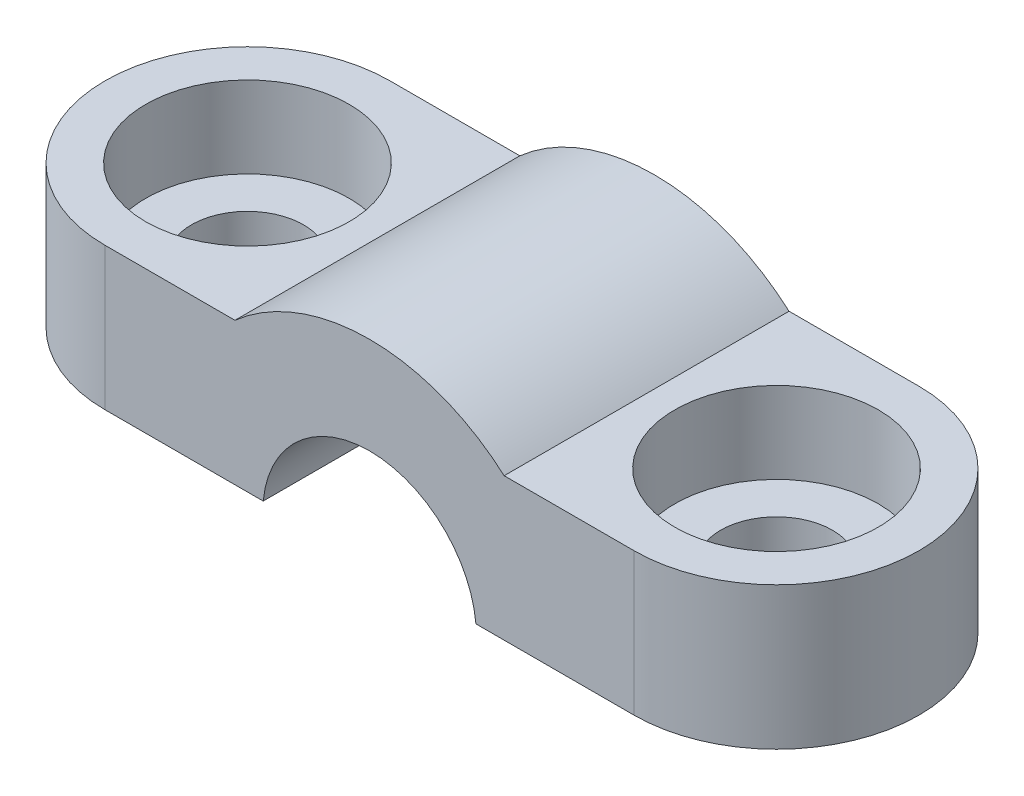
ISO-10303-21;
HEADER;
FILE_DESCRIPTION(('STEP AP214'),'2;1');
FILE_NAME('part.step','',(''),(''),'','','');
FILE_SCHEMA(('AUTOMOTIVE_DESIGN { 1 0 10303 214 1 1 1 1 }'));
ENDSEC;
DATA;
#1=APPLICATION_CONTEXT('core data for automotive mechanical design processes');
#2=APPLICATION_PROTOCOL_DEFINITION('international standard','automotive_design',2000,#1);
#3=PRODUCT_CONTEXT('',#1,'mechanical');
#4=PRODUCT('Part','Part','',(#3));
#5=PRODUCT_RELATED_PRODUCT_CATEGORY('part','',(#4));
#6=PRODUCT_DEFINITION_FORMATION('','',#4);
#7=PRODUCT_DEFINITION_CONTEXT('part definition',#1,'design');
#8=PRODUCT_DEFINITION('design','',#6,#7);
#9=PRODUCT_DEFINITION_SHAPE('','',#8);
#10=(LENGTH_UNIT() NAMED_UNIT(*) SI_UNIT(.MILLI.,.METRE.));
#11=(NAMED_UNIT(*) PLANE_ANGLE_UNIT() SI_UNIT($,.RADIAN.));
#12=(NAMED_UNIT(*) SI_UNIT($,.STERADIAN.) SOLID_ANGLE_UNIT());
#13=UNCERTAINTY_MEASURE_WITH_UNIT(LENGTH_MEASURE(1.E-05),#10,'distance_accuracy_value','');
#14=(GEOMETRIC_REPRESENTATION_CONTEXT(3) GLOBAL_UNCERTAINTY_ASSIGNED_CONTEXT((#13)) GLOBAL_UNIT_ASSIGNED_CONTEXT((#10,
#11,#12)) REPRESENTATION_CONTEXT('',''));
#15=CARTESIAN_POINT('',(0.,0.,0.));
#16=DIRECTION('',(0.,0.,1.));
#17=DIRECTION('',(1.,0.,0.));
#18=AXIS2_PLACEMENT_3D('',#15,#16,#17);
#19=CARTESIAN_POINT('',(-13.,7.,-7.00000000000001));
#20=DIRECTION('',(0.,1.,0.));
#21=DIRECTION('',(0.,0.,1.));
#22=AXIS2_PLACEMENT_3D('',#19,#20,#21);
#23=PLANE('',#22);
#24=DIRECTION('',(0.,0.,1.));
#25=VECTOR('',#24,1.);
#26=CARTESIAN_POINT('',(-6.61437827766148,7.,-27.4629120178363));
#27=LINE('',#26,#25);
#28=CARTESIAN_POINT('',(-6.61437827766148,7.,-14.));
#29=VERTEX_POINT('',#28);
#30=CARTESIAN_POINT('',(-6.61437827766148,7.,0.));
#31=VERTEX_POINT('',#30);
#32=EDGE_CURVE('E110',#29,#31,#27,.T.);
#33=ORIENTED_EDGE('',*,*,#32,.F.);
#34=DIRECTION('',(-1.,0.,0.));
#35=VECTOR('',#34,1.);
#36=CARTESIAN_POINT('',(-13.,7.,-14.));
#37=LINE('',#36,#35);
#38=CARTESIAN_POINT('',(-13.,7.,-14.));
#39=VERTEX_POINT('',#38);
#40=EDGE_CURVE('E96',#29,#39,#37,.T.);
#41=ORIENTED_EDGE('',*,*,#40,.T.);
#42=CARTESIAN_POINT('',(-13.,7.,-7.00000000000001));
#43=DIRECTION('',(0.,1.,0.));
#44=DIRECTION('',(0.,0.,1.));
#45=AXIS2_PLACEMENT_3D('',#42,#43,#44);
#46=CIRCLE('',#45,7.);
#47=CARTESIAN_POINT('',(-13.,7.,0.));
#48=VERTEX_POINT('',#47);
#49=EDGE_CURVE('E149',#39,#48,#46,.T.);
#50=ORIENTED_EDGE('',*,*,#49,.T.);
#51=DIRECTION('',(1.,0.,0.));
#52=VECTOR('',#51,1.);
#53=CARTESIAN_POINT('',(-13.,7.,0.));
#54=LINE('',#53,#52);
#55=EDGE_CURVE('E112',#48,#31,#54,.T.);
#56=ORIENTED_EDGE('',*,*,#55,.T.);
#57=EDGE_LOOP('',(#33,#41,#50,#56));
#58=FACE_BOUND('',#57,.T.);
#59=CARTESIAN_POINT('',(-13.,7.,-7.00000000000001));
#60=DIRECTION('',(0.,1.,0.));
#61=DIRECTION('',(0.,0.,1.));
#62=AXIS2_PLACEMENT_3D('',#59,#60,#61);
#63=CIRCLE('',#62,5.);
#64=CARTESIAN_POINT('',(-13.,7.,-2.00000000000001));
#65=VERTEX_POINT('',#64);
#66=EDGE_CURVE('E139',#65,#65,#63,.T.);
#67=ORIENTED_EDGE('',*,*,#66,.F.);
#68=EDGE_LOOP('',(#67));
#69=FACE_BOUND('',#68,.T.);
#70=ADVANCED_FACE('F33',(#58,#69),#23,.T.);
#71=CARTESIAN_POINT('',(-13.,0.,-7.00000000000001));
#72=DIRECTION('',(0.,1.,0.));
#73=DIRECTION('',(0.,0.,1.));
#74=AXIS2_PLACEMENT_3D('',#71,#72,#73);
#75=PLANE('',#74);
#76=CARTESIAN_POINT('',(-13.,0.,-7.00000000000001));
#77=DIRECTION('',(0.,1.,0.));
#78=DIRECTION('',(0.,0.,1.));
#79=AXIS2_PLACEMENT_3D('',#76,#77,#78);
#80=CIRCLE('',#79,2.75);
#81=CARTESIAN_POINT('',(-13.,0.,-4.25000000000001));
#82=VERTEX_POINT('',#81);
#83=EDGE_CURVE('E145',#82,#82,#80,.T.);
#84=ORIENTED_EDGE('',*,*,#83,.T.);
#85=EDGE_LOOP('',(#84));
#86=FACE_BOUND('',#85,.T.);
#87=DIRECTION('',(-1.,0.,0.));
#88=VECTOR('',#87,1.);
#89=CARTESIAN_POINT('',(-13.,0.,-14.));
#90=LINE('',#89,#88);
#91=CARTESIAN_POINT('',(-5.22613624009172,0.,-14.));
#92=VERTEX_POINT('',#91);
#93=CARTESIAN_POINT('',(-13.,0.,-14.));
#94=VERTEX_POINT('',#93);
#95=EDGE_CURVE('E163',#92,#94,#90,.T.);
#96=ORIENTED_EDGE('',*,*,#95,.F.);
#97=DIRECTION('',(0.,0.,1.));
#98=VECTOR('',#97,1.);
#99=CARTESIAN_POINT('',(-5.22613624009172,0.,-14.));
#100=LINE('',#99,#98);
#101=CARTESIAN_POINT('',(-5.22613624009172,0.,0.));
#102=VERTEX_POINT('',#101);
#103=EDGE_CURVE('E11',#92,#102,#100,.T.);
#104=ORIENTED_EDGE('',*,*,#103,.T.);
#105=DIRECTION('',(1.,0.,0.));
#106=VECTOR('',#105,1.);
#107=CARTESIAN_POINT('',(-13.,0.,0.));
#108=LINE('',#107,#106);
#109=CARTESIAN_POINT('',(-13.,0.,0.));
#110=VERTEX_POINT('',#109);
#111=EDGE_CURVE('E158',#110,#102,#108,.T.);
#112=ORIENTED_EDGE('',*,*,#111,.F.);
#113=CARTESIAN_POINT('',(-13.,0.,-7.00000000000001));
#114=DIRECTION('',(0.,1.,0.));
#115=DIRECTION('',(0.,0.,1.));
#116=AXIS2_PLACEMENT_3D('',#113,#114,#115);
#117=CIRCLE('',#116,7.);
#118=EDGE_CURVE('E148',#94,#110,#117,.T.);
#119=ORIENTED_EDGE('',*,*,#118,.F.);
#120=EDGE_LOOP('',(#96,#104,#112,#119));
#121=FACE_BOUND('',#120,.T.);
#122=ADVANCED_FACE('F196',(#86,#121),#75,.F.);
#123=CARTESIAN_POINT('',(-13.,0.,-7.00000000000001));
#124=DIRECTION('',(0.,1.,0.));
#125=DIRECTION('',(0.,0.,1.));
#126=AXIS2_PLACEMENT_3D('',#123,#124,#125);
#127=CYLINDRICAL_SURFACE('',#126,2.75);
#128=ORIENTED_EDGE('',*,*,#83,.F.);
#129=EDGE_LOOP('',(#128));
#130=FACE_BOUND('',#129,.T.);
#131=CARTESIAN_POINT('',(-13.,3.,-7.00000000000001));
#132=DIRECTION('',(0.,1.,0.));
#133=DIRECTION('',(0.,0.,1.));
#134=AXIS2_PLACEMENT_3D('',#131,#132,#133);
#135=CIRCLE('',#134,2.75);
#136=CARTESIAN_POINT('',(-13.,3.,-4.25000000000001));
#137=VERTEX_POINT('',#136);
#138=EDGE_CURVE('E138',#137,#137,#135,.F.);
#139=ORIENTED_EDGE('',*,*,#138,.F.);
#140=EDGE_LOOP('',(#139));
#141=FACE_BOUND('',#140,.T.);
#142=ADVANCED_FACE('F201',(#130,#141),#127,.F.);
#143=CARTESIAN_POINT('',(-13.,7.,-7.00000000000001));
#144=DIRECTION('',(0.,-1.,0.));
#145=DIRECTION('',(0.,0.,-1.));
#146=AXIS2_PLACEMENT_3D('',#143,#144,#145);
#147=CYLINDRICAL_SURFACE('',#146,7.);
#148=ORIENTED_EDGE('',*,*,#118,.T.);
#149=DIRECTION('',(0.,-1.,0.));
#150=VECTOR('',#149,1.);
#151=CARTESIAN_POINT('',(-13.,7.,0.));
#152=LINE('',#151,#150);
#153=EDGE_CURVE('E172',#48,#110,#152,.T.);
#154=ORIENTED_EDGE('',*,*,#153,.F.);
#155=ORIENTED_EDGE('',*,*,#49,.F.);
#156=DIRECTION('',(0.,-1.,0.));
#157=VECTOR('',#156,1.);
#158=CARTESIAN_POINT('',(-13.,7.,-14.));
#159=LINE('',#158,#157);
#160=EDGE_CURVE('E103',#39,#94,#159,.T.);
#161=ORIENTED_EDGE('',*,*,#160,.T.);
#162=EDGE_LOOP('',(#148,#154,#155,#161));
#163=FACE_BOUND('',#162,.T.);
#164=ADVANCED_FACE('F35',(#163),#147,.T.);
#165=CARTESIAN_POINT('',(-13.,7.,0.));
#166=DIRECTION('',(0.,0.,-1.));
#167=DIRECTION('',(-1.,0.,0.));
#168=AXIS2_PLACEMENT_3D('',#165,#166,#167);
#169=PLANE('',#168);
#170=ORIENTED_EDGE('',*,*,#111,.T.);
#171=CARTESIAN_POINT('',(0.,-0.5,0.));
#172=DIRECTION('',(0.,0.,1.));
#173=DIRECTION('',(1.,0.,0.));
#174=AXIS2_PLACEMENT_3D('',#171,#172,#173);
#175=CIRCLE('',#174,5.25);
#176=CARTESIAN_POINT('',(5.22613624009172,0.,0.));
#177=VERTEX_POINT('',#176);
#178=EDGE_CURVE('E119',#177,#102,#175,.T.);
#179=ORIENTED_EDGE('',*,*,#178,.F.);
#180=CARTESIAN_POINT('',(13.,0.,0.));
#181=VERTEX_POINT('',#180);
#182=EDGE_CURVE('E157',#177,#181,#108,.T.);
#183=ORIENTED_EDGE('',*,*,#182,.T.);
#184=DIRECTION('',(0.,-1.,0.));
#185=VECTOR('',#184,1.);
#186=CARTESIAN_POINT('',(13.,7.,0.));
#187=LINE('',#186,#185);
#188=CARTESIAN_POINT('',(13.,7.,0.));
#189=VERTEX_POINT('',#188);
#190=EDGE_CURVE('E169',#189,#181,#187,.T.);
#191=ORIENTED_EDGE('',*,*,#190,.F.);
#192=CARTESIAN_POINT('',(6.61437827766147,7.,0.));
#193=VERTEX_POINT('',#192);
#194=EDGE_CURVE('E151',#193,#189,#54,.T.);
#195=ORIENTED_EDGE('',*,*,#194,.F.);
#196=CARTESIAN_POINT('',(0.,-0.5,0.));
#197=DIRECTION('',(0.,0.,1.));
#198=DIRECTION('',(1.,0.,0.));
#199=AXIS2_PLACEMENT_3D('',#196,#197,#198);
#200=CIRCLE('',#199,10.);
#201=EDGE_CURVE('E116',#193,#31,#200,.T.);
#202=ORIENTED_EDGE('',*,*,#201,.T.);
#203=ORIENTED_EDGE('',*,*,#55,.F.);
#204=ORIENTED_EDGE('',*,*,#153,.T.);
#205=EDGE_LOOP('',(#170,#179,#183,#191,#195,#202,#203,#204));
#206=FACE_BOUND('',#205,.T.);
#207=ADVANCED_FACE('F193',(#206),#169,.F.);
#208=CARTESIAN_POINT('',(13.,7.,-7.00000000000001));
#209=DIRECTION('',(0.,-1.,0.));
#210=DIRECTION('',(0.,0.,-1.));
#211=AXIS2_PLACEMENT_3D('',#208,#209,#210);
#212=CYLINDRICAL_SURFACE('',#211,7.);
#213=CARTESIAN_POINT('',(13.,0.,-7.00000000000001));
#214=DIRECTION('',(0.,1.,0.));
#215=DIRECTION('',(0.,0.,-1.));
#216=AXIS2_PLACEMENT_3D('',#213,#214,#215);
#217=CIRCLE('',#216,7.);
#218=CARTESIAN_POINT('',(13.,0.,-14.));
#219=VERTEX_POINT('',#218);
#220=EDGE_CURVE('E161',#181,#219,#217,.T.);
#221=ORIENTED_EDGE('',*,*,#220,.T.);
#222=DIRECTION('',(0.,-1.,0.));
#223=VECTOR('',#222,1.);
#224=CARTESIAN_POINT('',(13.,7.,-14.));
#225=LINE('',#224,#223);
#226=CARTESIAN_POINT('',(13.,7.,-14.));
#227=VERTEX_POINT('',#226);
#228=EDGE_CURVE('E166',#227,#219,#225,.T.);
#229=ORIENTED_EDGE('',*,*,#228,.F.);
#230=CARTESIAN_POINT('',(13.,7.,-7.00000000000001));
#231=DIRECTION('',(0.,1.,0.));
#232=DIRECTION('',(0.,0.,-1.));
#233=AXIS2_PLACEMENT_3D('',#230,#231,#232);
#234=CIRCLE('',#233,7.);
#235=EDGE_CURVE('E107',#189,#227,#234,.T.);
#236=ORIENTED_EDGE('',*,*,#235,.F.);
#237=ORIENTED_EDGE('',*,*,#190,.T.);
#238=EDGE_LOOP('',(#221,#229,#236,#237));
#239=FACE_BOUND('',#238,.T.);
#240=ADVANCED_FACE('F190',(#239),#212,.T.);
#241=CARTESIAN_POINT('',(-13.,7.,-14.));
#242=DIRECTION('',(0.,0.,1.));
#243=DIRECTION('',(1.,0.,0.));
#244=AXIS2_PLACEMENT_3D('',#241,#242,#243);
#245=PLANE('',#244);
#246=CARTESIAN_POINT('',(5.22613624009171,0.,-14.));
#247=VERTEX_POINT('',#246);
#248=EDGE_CURVE('E152',#219,#247,#90,.T.);
#249=ORIENTED_EDGE('',*,*,#248,.T.);
#250=CARTESIAN_POINT('',(0.,-0.5,-14.));
#251=DIRECTION('',(0.,0.,1.));
#252=DIRECTION('',(1.,0.,0.));
#253=AXIS2_PLACEMENT_3D('',#250,#251,#252);
#254=CIRCLE('',#253,5.25);
#255=EDGE_CURVE('E121',#247,#92,#254,.T.);
#256=ORIENTED_EDGE('',*,*,#255,.T.);
#257=ORIENTED_EDGE('',*,*,#95,.T.);
#258=ORIENTED_EDGE('',*,*,#160,.F.);
#259=ORIENTED_EDGE('',*,*,#40,.F.);
#260=CARTESIAN_POINT('',(0.,-0.5,-14.));
#261=DIRECTION('',(0.,0.,1.));
#262=DIRECTION('',(1.,0.,0.));
#263=AXIS2_PLACEMENT_3D('',#260,#261,#262);
#264=CIRCLE('',#263,10.);
#265=CARTESIAN_POINT('',(6.61437827766147,7.,-14.));
#266=VERTEX_POINT('',#265);
#267=EDGE_CURVE('E101',#29,#266,#264,.F.);
#268=ORIENTED_EDGE('',*,*,#267,.T.);
#269=EDGE_CURVE('E48',#227,#266,#37,.T.);
#270=ORIENTED_EDGE('',*,*,#269,.F.);
#271=ORIENTED_EDGE('',*,*,#228,.T.);
#272=EDGE_LOOP('',(#249,#256,#257,#258,#259,#268,#270,#271));
#273=FACE_BOUND('',#272,.T.);
#274=ADVANCED_FACE('F99',(#273),#245,.F.);
#275=DIRECTION('',(0.,0.,1.));
#276=VECTOR('',#275,1.);
#277=CARTESIAN_POINT('',(6.61437827766148,7.,-27.4629120178363));
#278=LINE('',#277,#276);
#279=EDGE_CURVE('E53',#266,#193,#278,.T.);
#280=ORIENTED_EDGE('',*,*,#279,.T.);
#281=ORIENTED_EDGE('',*,*,#194,.T.);
#282=ORIENTED_EDGE('',*,*,#235,.T.);
#283=ORIENTED_EDGE('',*,*,#269,.T.);
#284=EDGE_LOOP('',(#280,#281,#282,#283));
#285=FACE_BOUND('',#284,.T.);
#286=CARTESIAN_POINT('',(13.,7.,-7.00000000000001));
#287=DIRECTION('',(0.,1.,0.));
#288=DIRECTION('',(0.,0.,-1.));
#289=AXIS2_PLACEMENT_3D('',#286,#287,#288);
#290=CIRCLE('',#289,5.);
#291=CARTESIAN_POINT('',(13.,7.,-12.));
#292=VERTEX_POINT('',#291);
#293=EDGE_CURVE('E127',#292,#292,#290,.T.);
#294=ORIENTED_EDGE('',*,*,#293,.F.);
#295=EDGE_LOOP('',(#294));
#296=FACE_BOUND('',#295,.T.);
#297=ADVANCED_FACE('F210',(#285,#296),#23,.T.);
#298=CARTESIAN_POINT('',(13.,0.,-7.00000000000001));
#299=DIRECTION('',(0.,1.,0.));
#300=DIRECTION('',(0.,0.,-1.));
#301=AXIS2_PLACEMENT_3D('',#298,#299,#300);
#302=CIRCLE('',#301,2.75);
#303=CARTESIAN_POINT('',(13.,0.,-9.75000000000001));
#304=VERTEX_POINT('',#303);
#305=EDGE_CURVE('E142',#304,#304,#302,.T.);
#306=ORIENTED_EDGE('',*,*,#305,.T.);
#307=EDGE_LOOP('',(#306));
#308=FACE_BOUND('',#307,.T.);
#309=ORIENTED_EDGE('',*,*,#182,.F.);
#310=DIRECTION('',(0.,0.,1.));
#311=VECTOR('',#310,1.);
#312=CARTESIAN_POINT('',(5.22613624009172,0.,-14.));
#313=LINE('',#312,#311);
#314=EDGE_CURVE('E41',#177,#247,#313,.F.);
#315=ORIENTED_EDGE('',*,*,#314,.T.);
#316=ORIENTED_EDGE('',*,*,#248,.F.);
#317=ORIENTED_EDGE('',*,*,#220,.F.);
#318=EDGE_LOOP('',(#309,#315,#316,#317));
#319=FACE_BOUND('',#318,.T.);
#320=ADVANCED_FACE('F182',(#308,#319),#75,.F.);
#321=CARTESIAN_POINT('',(13.,0.,-7.00000000000001));
#322=DIRECTION('',(0.,1.,0.));
#323=DIRECTION('',(0.,0.,1.));
#324=AXIS2_PLACEMENT_3D('',#321,#322,#323);
#325=CYLINDRICAL_SURFACE('',#324,2.75);
#326=CARTESIAN_POINT('',(13.,3.,-7.00000000000001));
#327=DIRECTION('',(0.,-1.,0.));
#328=DIRECTION('',(0.,0.,-1.));
#329=AXIS2_PLACEMENT_3D('',#326,#327,#328);
#330=CIRCLE('',#329,2.75);
#331=CARTESIAN_POINT('',(13.,3.,-9.75000000000001));
#332=VERTEX_POINT('',#331);
#333=EDGE_CURVE('E132',#332,#332,#330,.F.);
#334=ORIENTED_EDGE('',*,*,#333,.T.);
#335=EDGE_LOOP('',(#334));
#336=FACE_BOUND('',#335,.T.);
#337=ORIENTED_EDGE('',*,*,#305,.F.);
#338=EDGE_LOOP('',(#337));
#339=FACE_BOUND('',#338,.T.);
#340=ADVANCED_FACE('F221',(#336,#339),#325,.F.);
#341=CARTESIAN_POINT('',(-13.,3.,-7.00000000000001));
#342=DIRECTION('',(0.,1.,0.));
#343=DIRECTION('',(0.,0.,1.));
#344=AXIS2_PLACEMENT_3D('',#341,#342,#343);
#345=PLANE('',#344);
#346=CARTESIAN_POINT('',(-13.,3.,-7.00000000000001));
#347=DIRECTION('',(0.,1.,0.));
#348=DIRECTION('',(0.,0.,1.));
#349=AXIS2_PLACEMENT_3D('',#346,#347,#348);
#350=CIRCLE('',#349,5.);
#351=CARTESIAN_POINT('',(-13.,3.,-2.00000000000001));
#352=VERTEX_POINT('',#351);
#353=EDGE_CURVE('E135',#352,#352,#350,.T.);
#354=ORIENTED_EDGE('',*,*,#353,.T.);
#355=EDGE_LOOP('',(#354));
#356=FACE_BOUND('',#355,.T.);
#357=ORIENTED_EDGE('',*,*,#138,.T.);
#358=EDGE_LOOP('',(#357));
#359=FACE_BOUND('',#358,.T.);
#360=ADVANCED_FACE('F242',(#356,#359),#345,.T.);
#361=CARTESIAN_POINT('',(-13.,3.,-7.00000000000001));
#362=DIRECTION('',(0.,1.,0.));
#363=DIRECTION('',(0.,0.,1.));
#364=AXIS2_PLACEMENT_3D('',#361,#362,#363);
#365=CYLINDRICAL_SURFACE('',#364,5.);
#366=ORIENTED_EDGE('',*,*,#353,.F.);
#367=EDGE_LOOP('',(#366));
#368=FACE_BOUND('',#367,.T.);
#369=ORIENTED_EDGE('',*,*,#66,.T.);
#370=EDGE_LOOP('',(#369));
#371=FACE_BOUND('',#370,.T.);
#372=ADVANCED_FACE('F237',(#368,#371),#365,.F.);
#373=CARTESIAN_POINT('',(13.,3.,-7.00000000000001));
#374=DIRECTION('',(0.,-1.,0.));
#375=DIRECTION('',(0.,0.,-1.));
#376=AXIS2_PLACEMENT_3D('',#373,#374,#375);
#377=PLANE('',#376);
#378=CARTESIAN_POINT('',(13.,3.,-7.00000000000001));
#379=DIRECTION('',(0.,1.,0.));
#380=DIRECTION('',(0.,0.,-1.));
#381=AXIS2_PLACEMENT_3D('',#378,#379,#380);
#382=CIRCLE('',#381,5.);
#383=CARTESIAN_POINT('',(13.,3.,-12.));
#384=VERTEX_POINT('',#383);
#385=EDGE_CURVE('E129',#384,#384,#382,.T.);
#386=ORIENTED_EDGE('',*,*,#385,.T.);
#387=EDGE_LOOP('',(#386));
#388=FACE_BOUND('',#387,.T.);
#389=ORIENTED_EDGE('',*,*,#333,.F.);
#390=EDGE_LOOP('',(#389));
#391=FACE_BOUND('',#390,.T.);
#392=ADVANCED_FACE('F229',(#388,#391),#377,.F.);
#393=CARTESIAN_POINT('',(13.,3.,-7.00000000000001));
#394=DIRECTION('',(0.,1.,0.));
#395=DIRECTION('',(0.,0.,1.));
#396=AXIS2_PLACEMENT_3D('',#393,#394,#395);
#397=CYLINDRICAL_SURFACE('',#396,5.);
#398=ORIENTED_EDGE('',*,*,#385,.F.);
#399=EDGE_LOOP('',(#398));
#400=FACE_BOUND('',#399,.T.);
#401=ORIENTED_EDGE('',*,*,#293,.T.);
#402=EDGE_LOOP('',(#401));
#403=FACE_BOUND('',#402,.T.);
#404=ADVANCED_FACE('F227',(#400,#403),#397,.F.);
#405=CARTESIAN_POINT('',(0.,-0.5,-14.));
#406=DIRECTION('',(0.,0.,1.));
#407=DIRECTION('',(1.,0.,0.));
#408=AXIS2_PLACEMENT_3D('',#405,#406,#407);
#409=CYLINDRICAL_SURFACE('',#408,5.25);
#410=ORIENTED_EDGE('',*,*,#255,.F.);
#411=ORIENTED_EDGE('',*,*,#314,.F.);
#412=ORIENTED_EDGE('',*,*,#178,.T.);
#413=ORIENTED_EDGE('',*,*,#103,.F.);
#414=EDGE_LOOP('',(#410,#411,#412,#413));
#415=FACE_BOUND('',#414,.T.);
#416=ADVANCED_FACE('F194',(#415),#409,.F.);
#417=CARTESIAN_POINT('',(0.,-0.5,-27.4629120178363));
#418=DIRECTION('',(0.,0.,1.));
#419=DIRECTION('',(1.,0.,0.));
#420=AXIS2_PLACEMENT_3D('',#417,#418,#419);
#421=CYLINDRICAL_SURFACE('',#420,10.);
#422=ORIENTED_EDGE('',*,*,#267,.F.);
#423=ORIENTED_EDGE('',*,*,#32,.T.);
#424=ORIENTED_EDGE('',*,*,#201,.F.);
#425=ORIENTED_EDGE('',*,*,#279,.F.);
#426=EDGE_LOOP('',(#422,#423,#424,#425));
#427=FACE_BOUND('',#426,.T.);
#428=ADVANCED_FACE('F118',(#427),#421,.T.);
#429=CLOSED_SHELL('',(#70,#122,#142,#164,#207,#240,#274,#297,#320,#340,#360,#372,#392,#404,#416,#428));
#430=MANIFOLD_SOLID_BREP('B2',#429);
#431=ADVANCED_BREP_SHAPE_REPRESENTATION('',(#18,#430),#14);
#432=SHAPE_DEFINITION_REPRESENTATION(#9,#431);
ENDSEC;
END-ISO-10303-21;
